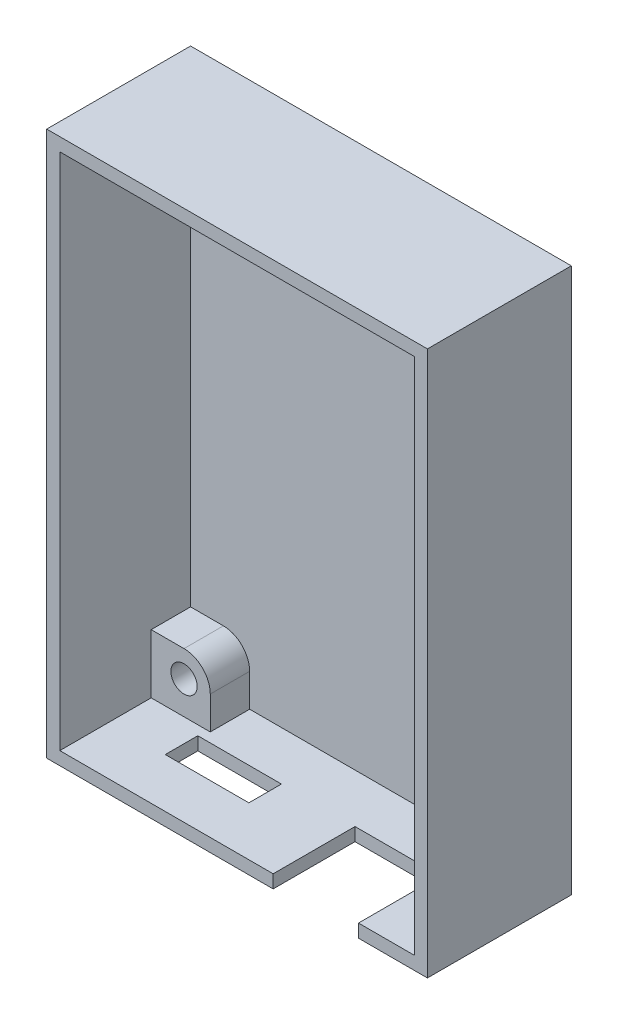
ISO-10303-21;
HEADER;
FILE_DESCRIPTION(('STEP AP214'),'2;1');
FILE_NAME('part.step','',(''),(''),'','','');
FILE_SCHEMA(('AUTOMOTIVE_DESIGN { 1 0 10303 214 1 1 1 1 }'));
ENDSEC;
DATA;
#1=APPLICATION_CONTEXT('core data for automotive mechanical design processes');
#2=APPLICATION_PROTOCOL_DEFINITION('international standard','automotive_design',2000,#1);
#3=PRODUCT_CONTEXT('',#1,'mechanical');
#4=PRODUCT('Part','Part','',(#3));
#5=PRODUCT_RELATED_PRODUCT_CATEGORY('part','',(#4));
#6=PRODUCT_DEFINITION_FORMATION('','',#4);
#7=PRODUCT_DEFINITION_CONTEXT('part definition',#1,'design');
#8=PRODUCT_DEFINITION('design','',#6,#7);
#9=PRODUCT_DEFINITION_SHAPE('','',#8);
#10=(LENGTH_UNIT() NAMED_UNIT(*) SI_UNIT(.MILLI.,.METRE.));
#11=(NAMED_UNIT(*) PLANE_ANGLE_UNIT() SI_UNIT($,.RADIAN.));
#12=(NAMED_UNIT(*) SI_UNIT($,.STERADIAN.) SOLID_ANGLE_UNIT());
#13=UNCERTAINTY_MEASURE_WITH_UNIT(LENGTH_MEASURE(1.E-05),#10,'distance_accuracy_value','');
#14=(GEOMETRIC_REPRESENTATION_CONTEXT(3) GLOBAL_UNCERTAINTY_ASSIGNED_CONTEXT((#13)) GLOBAL_UNIT_ASSIGNED_CONTEXT((#10,
#11,#12)) REPRESENTATION_CONTEXT('',''));
#15=CARTESIAN_POINT('',(0.,0.,0.));
#16=DIRECTION('',(0.,0.,1.));
#17=DIRECTION('',(1.,0.,0.));
#18=AXIS2_PLACEMENT_3D('',#15,#16,#17);
#19=CARTESIAN_POINT('',(0.,-41.5,21.92));
#20=DIRECTION('',(0.,1.,0.));
#21=DIRECTION('',(-1.,0.,0.));
#22=AXIS2_PLACEMENT_3D('',#19,#20,#21);
#23=PLANE('',#22);
#24=DIRECTION('',(0.,0.,1.));
#25=VECTOR('',#24,1.);
#26=CARTESIAN_POINT('',(-5.70999999999999,-41.5,9.45));
#27=LINE('',#26,#25);
#28=CARTESIAN_POINT('',(-5.70999999999999,-41.5,9.45));
#29=VERTEX_POINT('',#28);
#30=CARTESIAN_POINT('',(-5.71,-41.5,14.41));
#31=VERTEX_POINT('',#30);
#32=EDGE_CURVE('E272',#29,#31,#27,.T.);
#33=ORIENTED_EDGE('',*,*,#32,.F.);
#34=DIRECTION('',(1.,0.,0.));
#35=VECTOR('',#34,1.);
#36=CARTESIAN_POINT('',(-18.45,-41.5,9.45));
#37=LINE('',#36,#35);
#38=CARTESIAN_POINT('',(-18.45,-41.5,9.45));
#39=VERTEX_POINT('',#38);
#40=EDGE_CURVE('E266',#39,#29,#37,.T.);
#41=ORIENTED_EDGE('',*,*,#40,.F.);
#42=DIRECTION('',(0.,0.,-1.));
#43=VECTOR('',#42,1.);
#44=CARTESIAN_POINT('',(-18.45,-41.5,9.45));
#45=LINE('',#44,#43);
#46=CARTESIAN_POINT('',(-18.45,-41.5,14.41));
#47=VERTEX_POINT('',#46);
#48=EDGE_CURVE('E280',#47,#39,#45,.T.);
#49=ORIENTED_EDGE('',*,*,#48,.F.);
#50=DIRECTION('',(-1.,0.,0.));
#51=VECTOR('',#50,1.);
#52=CARTESIAN_POINT('',(-18.45,-41.5,14.41));
#53=LINE('',#52,#51);
#54=EDGE_CURVE('E57',#31,#47,#53,.T.);
#55=ORIENTED_EDGE('',*,*,#54,.F.);
#56=EDGE_LOOP('',(#33,#41,#49,#55));
#57=FACE_BOUND('',#56,.T.);
#58=DIRECTION('',(0.,0.,-1.));
#59=VECTOR('',#58,1.);
#60=CARTESIAN_POINT('',(5.50000000000001,-41.5,9.45));
#61=LINE('',#60,#59);
#62=CARTESIAN_POINT('',(5.5,-41.5,21.92));
#63=VERTEX_POINT('',#62);
#64=CARTESIAN_POINT('',(5.50000000000001,-41.5,9.45));
#65=VERTEX_POINT('',#64);
#66=EDGE_CURVE('E291',#63,#65,#61,.T.);
#67=ORIENTED_EDGE('',*,*,#66,.F.);
#68=DIRECTION('',(1.,0.,0.));
#69=VECTOR('',#68,1.);
#70=CARTESIAN_POINT('',(0.,-41.5,21.92));
#71=LINE('',#70,#69);
#72=CARTESIAN_POINT('',(-29.,-41.5,21.92));
#73=VERTEX_POINT('',#72);
#74=EDGE_CURVE('E502',#73,#63,#71,.T.);
#75=ORIENTED_EDGE('',*,*,#74,.F.);
#76=DIRECTION('',(0.,0.,-1.));
#77=VECTOR('',#76,1.);
#78=CARTESIAN_POINT('',(-29.,-41.5,21.92));
#79=LINE('',#78,#77);
#80=CARTESIAN_POINT('',(-29.,-41.5,0.));
#81=VERTEX_POINT('',#80);
#82=EDGE_CURVE('E525',#73,#81,#79,.T.);
#83=ORIENTED_EDGE('',*,*,#82,.T.);
#84=DIRECTION('',(1.,0.,0.));
#85=VECTOR('',#84,1.);
#86=CARTESIAN_POINT('',(0.,-41.5,0.));
#87=LINE('',#86,#85);
#88=CARTESIAN_POINT('',(29.,-41.5,0.));
#89=VERTEX_POINT('',#88);
#90=EDGE_CURVE('E514',#81,#89,#87,.T.);
#91=ORIENTED_EDGE('',*,*,#90,.T.);
#92=DIRECTION('',(0.,0.,-1.));
#93=VECTOR('',#92,1.);
#94=CARTESIAN_POINT('',(29.,-41.5,21.92));
#95=LINE('',#94,#93);
#96=CARTESIAN_POINT('',(29.,-41.5,21.92));
#97=VERTEX_POINT('',#96);
#98=EDGE_CURVE('E520',#97,#89,#95,.T.);
#99=ORIENTED_EDGE('',*,*,#98,.F.);
#100=CARTESIAN_POINT('',(18.5,-41.5,21.92));
#101=VERTEX_POINT('',#100);
#102=EDGE_CURVE('E504',#101,#97,#71,.T.);
#103=ORIENTED_EDGE('',*,*,#102,.F.);
#104=DIRECTION('',(0.,0.,1.));
#105=VECTOR('',#104,1.);
#106=CARTESIAN_POINT('',(18.5,-41.5,9.45000000000001));
#107=LINE('',#106,#105);
#108=CARTESIAN_POINT('',(18.5,-41.5,9.45000000000001));
#109=VERTEX_POINT('',#108);
#110=EDGE_CURVE('E290',#109,#101,#107,.T.);
#111=ORIENTED_EDGE('',*,*,#110,.F.);
#112=DIRECTION('',(1.,0.,0.));
#113=VECTOR('',#112,1.);
#114=CARTESIAN_POINT('',(5.50000000000001,-41.5,9.45));
#115=LINE('',#114,#113);
#116=EDGE_CURVE('E289',#65,#109,#115,.T.);
#117=ORIENTED_EDGE('',*,*,#116,.F.);
#118=EDGE_LOOP('',(#67,#75,#83,#91,#99,#103,#111,#117));
#119=FACE_BOUND('',#118,.T.);
#120=ADVANCED_FACE('F41',(#57,#119),#23,.F.);
#121=CARTESIAN_POINT('',(0.,-39.5,21.92));
#122=DIRECTION('',(0.,1.,0.));
#123=DIRECTION('',(-1.,0.,0.));
#124=AXIS2_PLACEMENT_3D('',#121,#122,#123);
#125=PLANE('',#124);
#126=DIRECTION('',(1.,0.,0.));
#127=VECTOR('',#126,1.);
#128=CARTESIAN_POINT('',(-18.45,-39.5,9.45));
#129=LINE('',#128,#127);
#130=CARTESIAN_POINT('',(-18.45,-39.5,9.45));
#131=VERTEX_POINT('',#130);
#132=CARTESIAN_POINT('',(-5.70999999999999,-39.5,9.45));
#133=VERTEX_POINT('',#132);
#134=EDGE_CURVE('E263',#131,#133,#129,.T.);
#135=ORIENTED_EDGE('',*,*,#134,.T.);
#136=DIRECTION('',(0.,0.,1.));
#137=VECTOR('',#136,1.);
#138=CARTESIAN_POINT('',(-5.70999999999999,-39.5,9.45));
#139=LINE('',#138,#137);
#140=CARTESIAN_POINT('',(-5.71,-39.5,14.41));
#141=VERTEX_POINT('',#140);
#142=EDGE_CURVE('E249',#133,#141,#139,.T.);
#143=ORIENTED_EDGE('',*,*,#142,.T.);
#144=DIRECTION('',(-1.,0.,0.));
#145=VECTOR('',#144,1.);
#146=CARTESIAN_POINT('',(-18.45,-39.5,14.41));
#147=LINE('',#146,#145);
#148=CARTESIAN_POINT('',(-18.45,-39.5,14.41));
#149=VERTEX_POINT('',#148);
#150=EDGE_CURVE('E283',#141,#149,#147,.T.);
#151=ORIENTED_EDGE('',*,*,#150,.T.);
#152=DIRECTION('',(0.,0.,-1.));
#153=VECTOR('',#152,1.);
#154=CARTESIAN_POINT('',(-18.45,-39.5,9.45));
#155=LINE('',#154,#153);
#156=EDGE_CURVE('E271',#149,#131,#155,.T.);
#157=ORIENTED_EDGE('',*,*,#156,.T.);
#158=EDGE_LOOP('',(#135,#143,#151,#157));
#159=FACE_BOUND('',#158,.T.);
#160=DIRECTION('',(1.,0.,0.));
#161=VECTOR('',#160,1.);
#162=CARTESIAN_POINT('',(0.,-39.5,21.92));
#163=LINE('',#162,#161);
#164=CARTESIAN_POINT('',(-27.,-39.5,21.92));
#165=VERTEX_POINT('',#164);
#166=CARTESIAN_POINT('',(5.5,-39.5,21.92));
#167=VERTEX_POINT('',#166);
#168=EDGE_CURVE('E491',#165,#167,#163,.T.);
#169=ORIENTED_EDGE('',*,*,#168,.T.);
#170=DIRECTION('',(0.,0.,-1.));
#171=VECTOR('',#170,1.);
#172=CARTESIAN_POINT('',(5.50000000000001,-39.5,9.45));
#173=LINE('',#172,#171);
#174=CARTESIAN_POINT('',(5.5,-39.5,9.45));
#175=VERTEX_POINT('',#174);
#176=EDGE_CURVE('E293',#167,#175,#173,.T.);
#177=ORIENTED_EDGE('',*,*,#176,.T.);
#178=DIRECTION('',(1.,0.,0.));
#179=VECTOR('',#178,1.);
#180=CARTESIAN_POINT('',(5.50000000000001,-39.5,9.45));
#181=LINE('',#180,#179);
#182=CARTESIAN_POINT('',(18.5,-39.5,9.45000000000001));
#183=VERTEX_POINT('',#182);
#184=EDGE_CURVE('E288',#175,#183,#181,.T.);
#185=ORIENTED_EDGE('',*,*,#184,.T.);
#186=DIRECTION('',(0.,0.,1.));
#187=VECTOR('',#186,1.);
#188=CARTESIAN_POINT('',(18.5,-39.5,9.45000000000001));
#189=LINE('',#188,#187);
#190=CARTESIAN_POINT('',(18.5,-39.5,21.92));
#191=VERTEX_POINT('',#190);
#192=EDGE_CURVE('E305',#183,#191,#189,.T.);
#193=ORIENTED_EDGE('',*,*,#192,.T.);
#194=CARTESIAN_POINT('',(27.,-39.5,21.92));
#195=VERTEX_POINT('',#194);
#196=EDGE_CURVE('E489',#191,#195,#163,.T.);
#197=ORIENTED_EDGE('',*,*,#196,.T.);
#198=DIRECTION('',(0.,0.,-1.));
#199=VECTOR('',#198,1.);
#200=CARTESIAN_POINT('',(27.,-39.5,21.92));
#201=LINE('',#200,#199);
#202=CARTESIAN_POINT('',(27.,-39.5,8.));
#203=VERTEX_POINT('',#202);
#204=EDGE_CURVE('E472',#195,#203,#201,.T.);
#205=ORIENTED_EDGE('',*,*,#204,.T.);
#206=DIRECTION('',(1.,0.,0.));
#207=VECTOR('',#206,1.);
#208=CARTESIAN_POINT('',(27.,-39.5,8.));
#209=LINE('',#208,#207);
#210=CARTESIAN_POINT('',(18.,-39.5,8.));
#211=VERTEX_POINT('',#210);
#212=EDGE_CURVE('E363',#211,#203,#209,.T.);
#213=ORIENTED_EDGE('',*,*,#212,.F.);
#214=DIRECTION('',(0.,0.,-1.));
#215=VECTOR('',#214,1.);
#216=CARTESIAN_POINT('',(18.,-39.5,8.));
#217=LINE('',#216,#215);
#218=CARTESIAN_POINT('',(18.,-39.5,2.));
#219=VERTEX_POINT('',#218);
#220=EDGE_CURVE('E385',#211,#219,#217,.T.);
#221=ORIENTED_EDGE('',*,*,#220,.T.);
#222=DIRECTION('',(1.,0.,0.));
#223=VECTOR('',#222,1.);
#224=CARTESIAN_POINT('',(0.,-39.5,2.));
#225=LINE('',#224,#223);
#226=CARTESIAN_POINT('',(-18.,-39.5,2.));
#227=VERTEX_POINT('',#226);
#228=EDGE_CURVE('E478',#227,#219,#225,.T.);
#229=ORIENTED_EDGE('',*,*,#228,.F.);
#230=DIRECTION('',(0.,0.,-1.));
#231=VECTOR('',#230,1.);
#232=CARTESIAN_POINT('',(-18.,-39.5,8.));
#233=LINE('',#232,#231);
#234=CARTESIAN_POINT('',(-18.,-39.5,8.));
#235=VERTEX_POINT('',#234);
#236=EDGE_CURVE('E414',#235,#227,#233,.T.);
#237=ORIENTED_EDGE('',*,*,#236,.F.);
#238=DIRECTION('',(1.,0.,0.));
#239=VECTOR('',#238,1.);
#240=CARTESIAN_POINT('',(-27.,-39.5,8.));
#241=LINE('',#240,#239);
#242=CARTESIAN_POINT('',(-27.,-39.5,8.));
#243=VERTEX_POINT('',#242);
#244=EDGE_CURVE('E399',#243,#235,#241,.T.);
#245=ORIENTED_EDGE('',*,*,#244,.F.);
#246=DIRECTION('',(0.,0.,-1.));
#247=VECTOR('',#246,1.);
#248=CARTESIAN_POINT('',(-27.,-39.5,21.92));
#249=LINE('',#248,#247);
#250=EDGE_CURVE('E467',#165,#243,#249,.T.);
#251=ORIENTED_EDGE('',*,*,#250,.F.);
#252=EDGE_LOOP('',(#169,#177,#185,#193,#197,#205,#213,#221,#229,#237,#245,#251));
#253=FACE_BOUND('',#252,.T.);
#254=ADVANCED_FACE('F267',(#159,#253),#125,.T.);
#255=CARTESIAN_POINT('',(0.,39.5,21.92));
#256=DIRECTION('',(0.,1.,0.));
#257=DIRECTION('',(-1.,0.,0.));
#258=AXIS2_PLACEMENT_3D('',#255,#256,#257);
#259=PLANE('',#258);
#260=DIRECTION('',(0.,0.,-1.));
#261=VECTOR('',#260,1.);
#262=CARTESIAN_POINT('',(18.,39.5,8.));
#263=LINE('',#262,#261);
#264=CARTESIAN_POINT('',(18.,39.5,8.));
#265=VERTEX_POINT('',#264);
#266=CARTESIAN_POINT('',(18.,39.5,2.));
#267=VERTEX_POINT('',#266);
#268=EDGE_CURVE('E340',#265,#267,#263,.T.);
#269=ORIENTED_EDGE('',*,*,#268,.F.);
#270=DIRECTION('',(-1.,0.,0.));
#271=VECTOR('',#270,1.);
#272=CARTESIAN_POINT('',(27.,39.5,8.));
#273=LINE('',#272,#271);
#274=CARTESIAN_POINT('',(27.,39.5,8.));
#275=VERTEX_POINT('',#274);
#276=EDGE_CURVE('E322',#275,#265,#273,.T.);
#277=ORIENTED_EDGE('',*,*,#276,.F.);
#278=DIRECTION('',(0.,0.,-1.));
#279=VECTOR('',#278,1.);
#280=CARTESIAN_POINT('',(27.,39.5,21.92));
#281=LINE('',#280,#279);
#282=CARTESIAN_POINT('',(27.,39.5,21.92));
#283=VERTEX_POINT('',#282);
#284=EDGE_CURVE('E468',#283,#275,#281,.T.);
#285=ORIENTED_EDGE('',*,*,#284,.F.);
#286=DIRECTION('',(1.,0.,0.));
#287=VECTOR('',#286,1.);
#288=CARTESIAN_POINT('',(0.,39.5,21.92));
#289=LINE('',#288,#287);
#290=CARTESIAN_POINT('',(-27.,39.5,21.92));
#291=VERTEX_POINT('',#290);
#292=EDGE_CURVE('E482',#291,#283,#289,.T.);
#293=ORIENTED_EDGE('',*,*,#292,.F.);
#294=DIRECTION('',(0.,0.,-1.));
#295=VECTOR('',#294,1.);
#296=CARTESIAN_POINT('',(-27.,39.5,21.92));
#297=LINE('',#296,#295);
#298=CARTESIAN_POINT('',(-27.,39.5,8.));
#299=VERTEX_POINT('',#298);
#300=EDGE_CURVE('E465',#291,#299,#297,.T.);
#301=ORIENTED_EDGE('',*,*,#300,.T.);
#302=DIRECTION('',(-1.,0.,0.));
#303=VECTOR('',#302,1.);
#304=CARTESIAN_POINT('',(-27.,39.5,8.));
#305=LINE('',#304,#303);
#306=CARTESIAN_POINT('',(-18.,39.5,8.));
#307=VERTEX_POINT('',#306);
#308=EDGE_CURVE('E433',#307,#299,#305,.T.);
#309=ORIENTED_EDGE('',*,*,#308,.F.);
#310=DIRECTION('',(0.,0.,-1.));
#311=VECTOR('',#310,1.);
#312=CARTESIAN_POINT('',(-18.,39.5,8.));
#313=LINE('',#312,#311);
#314=CARTESIAN_POINT('',(-18.,39.5,2.));
#315=VERTEX_POINT('',#314);
#316=EDGE_CURVE('E453',#307,#315,#313,.T.);
#317=ORIENTED_EDGE('',*,*,#316,.T.);
#318=DIRECTION('',(1.,0.,0.));
#319=VECTOR('',#318,1.);
#320=CARTESIAN_POINT('',(0.,39.5,2.));
#321=LINE('',#320,#319);
#322=EDGE_CURVE('E458',#315,#267,#321,.T.);
#323=ORIENTED_EDGE('',*,*,#322,.T.);
#324=EDGE_LOOP('',(#269,#277,#285,#293,#301,#309,#317,#323));
#325=FACE_BOUND('',#324,.T.);
#326=ADVANCED_FACE('F592',(#325),#259,.F.);
#327=CARTESIAN_POINT('',(-27.,0.,21.92));
#328=DIRECTION('',(-1.,0.,0.));
#329=DIRECTION('',(0.,0.,1.));
#330=AXIS2_PLACEMENT_3D('',#327,#328,#329);
#331=PLANE('',#330);
#332=DIRECTION('',(0.,-1.,0.));
#333=VECTOR('',#332,1.);
#334=CARTESIAN_POINT('',(-27.,-39.5,8.));
#335=LINE('',#334,#333);
#336=CARTESIAN_POINT('',(-27.,-30.5,8.));
#337=VERTEX_POINT('',#336);
#338=EDGE_CURVE('E400',#337,#243,#335,.T.);
#339=ORIENTED_EDGE('',*,*,#338,.F.);
#340=DIRECTION('',(0.,0.,-1.));
#341=VECTOR('',#340,1.);
#342=CARTESIAN_POINT('',(-27.,-30.5,8.));
#343=LINE('',#342,#341);
#344=CARTESIAN_POINT('',(-27.,-30.5,2.));
#345=VERTEX_POINT('',#344);
#346=EDGE_CURVE('E416',#337,#345,#343,.T.);
#347=ORIENTED_EDGE('',*,*,#346,.T.);
#348=DIRECTION('',(0.,1.,0.));
#349=VECTOR('',#348,1.);
#350=CARTESIAN_POINT('',(-27.,0.,2.));
#351=LINE('',#350,#349);
#352=CARTESIAN_POINT('',(-27.,30.5,2.));
#353=VERTEX_POINT('',#352);
#354=EDGE_CURVE('E462',#345,#353,#351,.T.);
#355=ORIENTED_EDGE('',*,*,#354,.T.);
#356=DIRECTION('',(0.,0.,-1.));
#357=VECTOR('',#356,1.);
#358=CARTESIAN_POINT('',(-27.,30.5,8.));
#359=LINE('',#358,#357);
#360=CARTESIAN_POINT('',(-27.,30.5,8.));
#361=VERTEX_POINT('',#360);
#362=EDGE_CURVE('E451',#361,#353,#359,.T.);
#363=ORIENTED_EDGE('',*,*,#362,.F.);
#364=DIRECTION('',(0.,-1.,0.));
#365=VECTOR('',#364,1.);
#366=CARTESIAN_POINT('',(-27.,39.5,8.));
#367=LINE('',#366,#365);
#368=EDGE_CURVE('E436',#299,#361,#367,.T.);
#369=ORIENTED_EDGE('',*,*,#368,.F.);
#370=ORIENTED_EDGE('',*,*,#300,.F.);
#371=DIRECTION('',(0.,1.,0.));
#372=VECTOR('',#371,1.);
#373=CARTESIAN_POINT('',(-27.,0.,21.92));
#374=LINE('',#373,#372);
#375=EDGE_CURVE('E490',#165,#291,#374,.T.);
#376=ORIENTED_EDGE('',*,*,#375,.F.);
#377=ORIENTED_EDGE('',*,*,#250,.T.);
#378=EDGE_LOOP('',(#339,#347,#355,#363,#369,#370,#376,#377));
#379=FACE_BOUND('',#378,.T.);
#380=ADVANCED_FACE('F608',(#379),#331,.F.);
#381=CARTESIAN_POINT('',(0.,0.,2.));
#382=DIRECTION('',(0.,0.,1.));
#383=DIRECTION('',(1.,0.,0.));
#384=AXIS2_PLACEMENT_3D('',#381,#382,#383);
#385=PLANE('',#384);
#386=DIRECTION('',(0.,1.,0.));
#387=VECTOR('',#386,1.);
#388=CARTESIAN_POINT('',(-18.,-39.5,2.));
#389=LINE('',#388,#387);
#390=CARTESIAN_POINT('',(-18.,-34.5,2.));
#391=VERTEX_POINT('',#390);
#392=EDGE_CURVE('E395',#227,#391,#389,.T.);
#393=ORIENTED_EDGE('',*,*,#392,.F.);
#394=ORIENTED_EDGE('',*,*,#228,.T.);
#395=DIRECTION('',(0.,-1.,0.));
#396=VECTOR('',#395,1.);
#397=CARTESIAN_POINT('',(18.,-39.5,2.));
#398=LINE('',#397,#396);
#399=CARTESIAN_POINT('',(18.,-34.5,2.));
#400=VERTEX_POINT('',#399);
#401=EDGE_CURVE('E375',#400,#219,#398,.T.);
#402=ORIENTED_EDGE('',*,*,#401,.F.);
#403=CARTESIAN_POINT('',(22.,-34.5,2.));
#404=DIRECTION('',(0.,0.,1.));
#405=DIRECTION('',(-1.,0.,0.));
#406=AXIS2_PLACEMENT_3D('',#403,#404,#405);
#407=CIRCLE('',#406,4.);
#408=CARTESIAN_POINT('',(22.,-30.5,2.));
#409=VERTEX_POINT('',#408);
#410=EDGE_CURVE('E354',#409,#400,#407,.T.);
#411=ORIENTED_EDGE('',*,*,#410,.F.);
#412=DIRECTION('',(-1.,0.,0.));
#413=VECTOR('',#412,1.);
#414=CARTESIAN_POINT('',(27.,-30.5,2.));
#415=LINE('',#414,#413);
#416=CARTESIAN_POINT('',(27.,-30.5,2.));
#417=VERTEX_POINT('',#416);
#418=EDGE_CURVE('E357',#417,#409,#415,.T.);
#419=ORIENTED_EDGE('',*,*,#418,.F.);
#420=DIRECTION('',(0.,1.,0.));
#421=VECTOR('',#420,1.);
#422=CARTESIAN_POINT('',(27.,0.,2.));
#423=LINE('',#422,#421);
#424=CARTESIAN_POINT('',(27.,30.5,2.));
#425=VERTEX_POINT('',#424);
#426=EDGE_CURVE('E477',#417,#425,#423,.T.);
#427=ORIENTED_EDGE('',*,*,#426,.T.);
#428=DIRECTION('',(1.,0.,0.));
#429=VECTOR('',#428,1.);
#430=CARTESIAN_POINT('',(27.,30.5,2.));
#431=LINE('',#430,#429);
#432=CARTESIAN_POINT('',(22.,30.5,2.));
#433=VERTEX_POINT('',#432);
#434=EDGE_CURVE('E335',#433,#425,#431,.T.);
#435=ORIENTED_EDGE('',*,*,#434,.F.);
#436=CARTESIAN_POINT('',(22.,34.5,2.));
#437=DIRECTION('',(0.,0.,1.));
#438=DIRECTION('',(1.,0.,0.));
#439=AXIS2_PLACEMENT_3D('',#436,#437,#438);
#440=CIRCLE('',#439,4.);
#441=CARTESIAN_POINT('',(18.,34.5,2.));
#442=VERTEX_POINT('',#441);
#443=EDGE_CURVE('E315',#442,#433,#440,.T.);
#444=ORIENTED_EDGE('',*,*,#443,.F.);
#445=DIRECTION('',(0.,-1.,0.));
#446=VECTOR('',#445,1.);
#447=CARTESIAN_POINT('',(18.,39.5,2.));
#448=LINE('',#447,#446);
#449=EDGE_CURVE('E318',#267,#442,#448,.T.);
#450=ORIENTED_EDGE('',*,*,#449,.F.);
#451=ORIENTED_EDGE('',*,*,#322,.F.);
#452=DIRECTION('',(0.,1.,0.));
#453=VECTOR('',#452,1.);
#454=CARTESIAN_POINT('',(-18.,39.5,2.));
#455=LINE('',#454,#453);
#456=CARTESIAN_POINT('',(-18.,34.5,2.));
#457=VERTEX_POINT('',#456);
#458=EDGE_CURVE('E441',#457,#315,#455,.T.);
#459=ORIENTED_EDGE('',*,*,#458,.F.);
#460=CARTESIAN_POINT('',(-22.,34.5,2.));
#461=DIRECTION('',(0.,0.,1.));
#462=DIRECTION('',(-1.,0.,0.));
#463=AXIS2_PLACEMENT_3D('',#460,#461,#462);
#464=CIRCLE('',#463,4.);
#465=CARTESIAN_POINT('',(-22.,30.5,2.));
#466=VERTEX_POINT('',#465);
#467=EDGE_CURVE('E422',#466,#457,#464,.T.);
#468=ORIENTED_EDGE('',*,*,#467,.F.);
#469=DIRECTION('',(1.,0.,0.));
#470=VECTOR('',#469,1.);
#471=CARTESIAN_POINT('',(-27.,30.5,2.));
#472=LINE('',#471,#470);
#473=EDGE_CURVE('E429',#353,#466,#472,.T.);
#474=ORIENTED_EDGE('',*,*,#473,.F.);
#475=ORIENTED_EDGE('',*,*,#354,.F.);
#476=DIRECTION('',(-1.,0.,0.));
#477=VECTOR('',#476,1.);
#478=CARTESIAN_POINT('',(-27.,-30.5,2.));
#479=LINE('',#478,#477);
#480=CARTESIAN_POINT('',(-22.,-30.5,2.));
#481=VERTEX_POINT('',#480);
#482=EDGE_CURVE('E407',#481,#345,#479,.T.);
#483=ORIENTED_EDGE('',*,*,#482,.F.);
#484=CARTESIAN_POINT('',(-22.,-34.5,2.));
#485=DIRECTION('',(0.,0.,1.));
#486=DIRECTION('',(1.,0.,0.));
#487=AXIS2_PLACEMENT_3D('',#484,#485,#486);
#488=CIRCLE('',#487,4.);
#489=EDGE_CURVE('E386',#391,#481,#488,.T.);
#490=ORIENTED_EDGE('',*,*,#489,.F.);
#491=EDGE_LOOP('',(#393,#394,#402,#411,#419,#427,#435,#444,#450,#451,#459,#468,#474,#475,#483,#490));
#492=FACE_BOUND('',#491,.T.);
#493=ADVANCED_FACE('F588',(#492),#385,.T.);
#494=CARTESIAN_POINT('',(0.,0.,21.92));
#495=DIRECTION('',(0.,0.,1.));
#496=DIRECTION('',(1.,0.,0.));
#497=AXIS2_PLACEMENT_3D('',#494,#495,#496);
#498=PLANE('',#497);
#499=DIRECTION('',(0.,1.,0.));
#500=VECTOR('',#499,1.);
#501=CARTESIAN_POINT('',(18.5,0.,21.92));
#502=LINE('',#501,#500);
#503=EDGE_CURVE('E11',#101,#191,#502,.T.);
#504=ORIENTED_EDGE('',*,*,#503,.F.);
#505=ORIENTED_EDGE('',*,*,#102,.T.);
#506=DIRECTION('',(0.,1.,0.));
#507=VECTOR('',#506,1.);
#508=CARTESIAN_POINT('',(29.,0.,21.92));
#509=LINE('',#508,#507);
#510=CARTESIAN_POINT('',(29.,41.5,21.92));
#511=VERTEX_POINT('',#510);
#512=EDGE_CURVE('E506',#97,#511,#509,.T.);
#513=ORIENTED_EDGE('',*,*,#512,.T.);
#514=DIRECTION('',(1.,0.,0.));
#515=VECTOR('',#514,1.);
#516=CARTESIAN_POINT('',(0.,41.5,21.92));
#517=LINE('',#516,#515);
#518=CARTESIAN_POINT('',(-29.,41.5,21.92));
#519=VERTEX_POINT('',#518);
#520=EDGE_CURVE('E494',#519,#511,#517,.T.);
#521=ORIENTED_EDGE('',*,*,#520,.F.);
#522=DIRECTION('',(0.,1.,0.));
#523=VECTOR('',#522,1.);
#524=CARTESIAN_POINT('',(-29.,0.,21.92));
#525=LINE('',#524,#523);
#526=EDGE_CURVE('E499',#73,#519,#525,.T.);
#527=ORIENTED_EDGE('',*,*,#526,.F.);
#528=ORIENTED_EDGE('',*,*,#74,.T.);
#529=DIRECTION('',(0.,-1.,0.));
#530=VECTOR('',#529,1.);
#531=CARTESIAN_POINT('',(5.5,0.,21.92));
#532=LINE('',#531,#530);
#533=EDGE_CURVE('E47',#167,#63,#532,.T.);
#534=ORIENTED_EDGE('',*,*,#533,.F.);
#535=ORIENTED_EDGE('',*,*,#168,.F.);
#536=ORIENTED_EDGE('',*,*,#375,.T.);
#537=ORIENTED_EDGE('',*,*,#292,.T.);
#538=DIRECTION('',(0.,1.,0.));
#539=VECTOR('',#538,1.);
#540=CARTESIAN_POINT('',(27.,0.,21.92));
#541=LINE('',#540,#539);
#542=EDGE_CURVE('E471',#195,#283,#541,.T.);
#543=ORIENTED_EDGE('',*,*,#542,.F.);
#544=ORIENTED_EDGE('',*,*,#196,.F.);
#545=EDGE_LOOP('',(#504,#505,#513,#521,#527,#528,#534,#535,#536,#537,#543,#544));
#546=FACE_BOUND('',#545,.T.);
#547=ADVANCED_FACE('F548',(#546),#498,.T.);
#548=CARTESIAN_POINT('',(0.,41.5,21.92));
#549=DIRECTION('',(0.,1.,0.));
#550=DIRECTION('',(-1.,0.,0.));
#551=AXIS2_PLACEMENT_3D('',#548,#549,#550);
#552=PLANE('',#551);
#553=DIRECTION('',(1.,0.,0.));
#554=VECTOR('',#553,1.);
#555=CARTESIAN_POINT('',(0.,41.5,0.));
#556=LINE('',#555,#554);
#557=CARTESIAN_POINT('',(-29.,41.5,0.));
#558=VERTEX_POINT('',#557);
#559=CARTESIAN_POINT('',(29.,41.5,0.));
#560=VERTEX_POINT('',#559);
#561=EDGE_CURVE('E470',#558,#560,#556,.T.);
#562=ORIENTED_EDGE('',*,*,#561,.F.);
#563=DIRECTION('',(0.,0.,-1.));
#564=VECTOR('',#563,1.);
#565=CARTESIAN_POINT('',(-29.,41.5,21.92));
#566=LINE('',#565,#564);
#567=EDGE_CURVE('E523',#519,#558,#566,.T.);
#568=ORIENTED_EDGE('',*,*,#567,.F.);
#569=ORIENTED_EDGE('',*,*,#520,.T.);
#570=DIRECTION('',(0.,0.,-1.));
#571=VECTOR('',#570,1.);
#572=CARTESIAN_POINT('',(29.,41.5,21.92));
#573=LINE('',#572,#571);
#574=EDGE_CURVE('E507',#511,#560,#573,.T.);
#575=ORIENTED_EDGE('',*,*,#574,.T.);
#576=EDGE_LOOP('',(#562,#568,#569,#575));
#577=FACE_BOUND('',#576,.T.);
#578=ADVANCED_FACE('F43',(#577),#552,.T.);
#579=CARTESIAN_POINT('',(-29.,0.,21.92));
#580=DIRECTION('',(-1.,0.,0.));
#581=DIRECTION('',(0.,0.,1.));
#582=AXIS2_PLACEMENT_3D('',#579,#580,#581);
#583=PLANE('',#582);
#584=DIRECTION('',(0.,1.,0.));
#585=VECTOR('',#584,1.);
#586=CARTESIAN_POINT('',(-29.,0.,0.));
#587=LINE('',#586,#585);
#588=EDGE_CURVE('E512',#81,#558,#587,.T.);
#589=ORIENTED_EDGE('',*,*,#588,.F.);
#590=ORIENTED_EDGE('',*,*,#82,.F.);
#591=ORIENTED_EDGE('',*,*,#526,.T.);
#592=ORIENTED_EDGE('',*,*,#567,.T.);
#593=EDGE_LOOP('',(#589,#590,#591,#592));
#594=FACE_BOUND('',#593,.T.);
#595=ADVANCED_FACE('F554',(#594),#583,.T.);
#596=CARTESIAN_POINT('',(29.,0.,21.92));
#597=DIRECTION('',(-1.,0.,0.));
#598=DIRECTION('',(0.,0.,1.));
#599=AXIS2_PLACEMENT_3D('',#596,#597,#598);
#600=PLANE('',#599);
#601=DIRECTION('',(0.,1.,0.));
#602=VECTOR('',#601,1.);
#603=CARTESIAN_POINT('',(29.,0.,0.));
#604=LINE('',#603,#602);
#605=EDGE_CURVE('E496',#89,#560,#604,.T.);
#606=ORIENTED_EDGE('',*,*,#605,.T.);
#607=ORIENTED_EDGE('',*,*,#574,.F.);
#608=ORIENTED_EDGE('',*,*,#512,.F.);
#609=ORIENTED_EDGE('',*,*,#98,.T.);
#610=EDGE_LOOP('',(#606,#607,#608,#609));
#611=FACE_BOUND('',#610,.T.);
#612=ADVANCED_FACE('F565',(#611),#600,.F.);
#613=CARTESIAN_POINT('',(0.,0.,0.));
#614=DIRECTION('',(0.,0.,1.));
#615=DIRECTION('',(1.,0.,0.));
#616=AXIS2_PLACEMENT_3D('',#613,#614,#615);
#617=PLANE('',#616);
#618=ORIENTED_EDGE('',*,*,#561,.T.);
#619=ORIENTED_EDGE('',*,*,#605,.F.);
#620=ORIENTED_EDGE('',*,*,#90,.F.);
#621=ORIENTED_EDGE('',*,*,#588,.T.);
#622=EDGE_LOOP('',(#618,#619,#620,#621));
#623=FACE_BOUND('',#622,.T.);
#624=ADVANCED_FACE('F560',(#623),#617,.F.);
#625=CARTESIAN_POINT('',(27.,0.,21.92));
#626=DIRECTION('',(-1.,0.,0.));
#627=DIRECTION('',(0.,0.,1.));
#628=AXIS2_PLACEMENT_3D('',#625,#626,#627);
#629=PLANE('',#628);
#630=DIRECTION('',(0.,0.,-1.));
#631=VECTOR('',#630,1.);
#632=CARTESIAN_POINT('',(27.,-30.5,8.));
#633=LINE('',#632,#631);
#634=CARTESIAN_POINT('',(27.,-30.5,8.));
#635=VERTEX_POINT('',#634);
#636=EDGE_CURVE('E377',#635,#417,#633,.T.);
#637=ORIENTED_EDGE('',*,*,#636,.F.);
#638=DIRECTION('',(0.,1.,0.));
#639=VECTOR('',#638,1.);
#640=CARTESIAN_POINT('',(27.,-39.5,8.));
#641=LINE('',#640,#639);
#642=EDGE_CURVE('E365',#203,#635,#641,.T.);
#643=ORIENTED_EDGE('',*,*,#642,.F.);
#644=ORIENTED_EDGE('',*,*,#204,.F.);
#645=ORIENTED_EDGE('',*,*,#542,.T.);
#646=ORIENTED_EDGE('',*,*,#284,.T.);
#647=DIRECTION('',(0.,1.,0.));
#648=VECTOR('',#647,1.);
#649=CARTESIAN_POINT('',(27.,39.5,8.));
#650=LINE('',#649,#648);
#651=CARTESIAN_POINT('',(27.,30.5,8.));
#652=VERTEX_POINT('',#651);
#653=EDGE_CURVE('E321',#652,#275,#650,.T.);
#654=ORIENTED_EDGE('',*,*,#653,.F.);
#655=DIRECTION('',(0.,0.,-1.));
#656=VECTOR('',#655,1.);
#657=CARTESIAN_POINT('',(27.,30.5,8.));
#658=LINE('',#657,#656);
#659=EDGE_CURVE('E345',#652,#425,#658,.T.);
#660=ORIENTED_EDGE('',*,*,#659,.T.);
#661=ORIENTED_EDGE('',*,*,#426,.F.);
#662=EDGE_LOOP('',(#637,#643,#644,#645,#646,#654,#660,#661));
#663=FACE_BOUND('',#662,.T.);
#664=ADVANCED_FACE('F611',(#663),#629,.T.);
#665=CARTESIAN_POINT('',(-22.,34.5,8.));
#666=DIRECTION('',(0.,0.,-1.));
#667=DIRECTION('',(-1.,0.,0.));
#668=AXIS2_PLACEMENT_3D('',#665,#666,#667);
#669=PLANE('',#668);
#670=CARTESIAN_POINT('',(-22.,34.5,8.));
#671=DIRECTION('',(0.,0.,1.));
#672=DIRECTION('',(-1.,0.,0.));
#673=AXIS2_PLACEMENT_3D('',#670,#671,#672);
#674=CIRCLE('',#673,4.);
#675=CARTESIAN_POINT('',(-22.,30.5,8.));
#676=VERTEX_POINT('',#675);
#677=CARTESIAN_POINT('',(-18.,34.5,8.));
#678=VERTEX_POINT('',#677);
#679=EDGE_CURVE('E426',#676,#678,#674,.T.);
#680=ORIENTED_EDGE('',*,*,#679,.T.);
#681=DIRECTION('',(0.,1.,0.));
#682=VECTOR('',#681,1.);
#683=CARTESIAN_POINT('',(-18.,39.5,8.));
#684=LINE('',#683,#682);
#685=EDGE_CURVE('E427',#678,#307,#684,.T.);
#686=ORIENTED_EDGE('',*,*,#685,.T.);
#687=ORIENTED_EDGE('',*,*,#308,.T.);
#688=ORIENTED_EDGE('',*,*,#368,.T.);
#689=DIRECTION('',(1.,0.,0.));
#690=VECTOR('',#689,1.);
#691=CARTESIAN_POINT('',(-27.,30.5,8.));
#692=LINE('',#691,#690);
#693=EDGE_CURVE('E438',#361,#676,#692,.T.);
#694=ORIENTED_EDGE('',*,*,#693,.T.);
#695=EDGE_LOOP('',(#680,#686,#687,#688,#694));
#696=FACE_BOUND('',#695,.T.);
#697=CARTESIAN_POINT('',(-22.,34.5,8.));
#698=DIRECTION('',(0.,0.,1.));
#699=DIRECTION('',(1.,0.,0.));
#700=AXIS2_PLACEMENT_3D('',#697,#698,#699);
#701=CIRCLE('',#700,2.);
#702=CARTESIAN_POINT('',(-20.,34.5,8.));
#703=VERTEX_POINT('',#702);
#704=EDGE_CURVE('E346',#703,#703,#701,.T.);
#705=ORIENTED_EDGE('',*,*,#704,.F.);
#706=EDGE_LOOP('',(#705));
#707=FACE_BOUND('',#706,.T.);
#708=ADVANCED_FACE('F619',(#696,#707),#669,.F.);
#709=CARTESIAN_POINT('',(-22.,34.5,8.));
#710=DIRECTION('',(0.,0.,-1.));
#711=DIRECTION('',(-1.,0.,0.));
#712=AXIS2_PLACEMENT_3D('',#709,#710,#711);
#713=CYLINDRICAL_SURFACE('',#712,4.);
#714=ORIENTED_EDGE('',*,*,#467,.T.);
#715=DIRECTION('',(0.,0.,-1.));
#716=VECTOR('',#715,1.);
#717=CARTESIAN_POINT('',(-18.,34.5,8.));
#718=LINE('',#717,#716);
#719=EDGE_CURVE('E460',#678,#457,#718,.T.);
#720=ORIENTED_EDGE('',*,*,#719,.F.);
#721=ORIENTED_EDGE('',*,*,#679,.F.);
#722=DIRECTION('',(0.,0.,-1.));
#723=VECTOR('',#722,1.);
#724=CARTESIAN_POINT('',(-22.,30.5,8.));
#725=LINE('',#724,#723);
#726=EDGE_CURVE('E442',#676,#466,#725,.T.);
#727=ORIENTED_EDGE('',*,*,#726,.T.);
#728=EDGE_LOOP('',(#714,#720,#721,#727));
#729=FACE_BOUND('',#728,.T.);
#730=ADVANCED_FACE('F623',(#729),#713,.T.);
#731=CARTESIAN_POINT('',(-18.,39.5,8.));
#732=DIRECTION('',(-1.,0.,0.));
#733=DIRECTION('',(0.,0.,1.));
#734=AXIS2_PLACEMENT_3D('',#731,#732,#733);
#735=PLANE('',#734);
#736=ORIENTED_EDGE('',*,*,#458,.T.);
#737=ORIENTED_EDGE('',*,*,#316,.F.);
#738=ORIENTED_EDGE('',*,*,#685,.F.);
#739=ORIENTED_EDGE('',*,*,#719,.T.);
#740=EDGE_LOOP('',(#736,#737,#738,#739));
#741=FACE_BOUND('',#740,.T.);
#742=ADVANCED_FACE('F638',(#741),#735,.F.);
#743=CARTESIAN_POINT('',(-27.,30.5,8.));
#744=DIRECTION('',(0.,1.,0.));
#745=DIRECTION('',(-1.,0.,0.));
#746=AXIS2_PLACEMENT_3D('',#743,#744,#745);
#747=PLANE('',#746);
#748=ORIENTED_EDGE('',*,*,#473,.T.);
#749=ORIENTED_EDGE('',*,*,#726,.F.);
#750=ORIENTED_EDGE('',*,*,#693,.F.);
#751=ORIENTED_EDGE('',*,*,#362,.T.);
#752=EDGE_LOOP('',(#748,#749,#750,#751));
#753=FACE_BOUND('',#752,.T.);
#754=ADVANCED_FACE('F639',(#753),#747,.F.);
#755=CARTESIAN_POINT('',(-22.,34.5,8.));
#756=DIRECTION('',(0.,0.,-1.));
#757=DIRECTION('',(-1.,0.,0.));
#758=AXIS2_PLACEMENT_3D('',#755,#756,#757);
#759=CYLINDRICAL_SURFACE('',#758,2.);
#760=ORIENTED_EDGE('',*,*,#704,.T.);
#761=EDGE_LOOP('',(#760));
#762=FACE_BOUND('',#761,.T.);
#763=CARTESIAN_POINT('',(-22.,34.5,2.));
#764=DIRECTION('',(0.,0.,1.));
#765=DIRECTION('',(1.,0.,0.));
#766=AXIS2_PLACEMENT_3D('',#763,#764,#765);
#767=CIRCLE('',#766,2.);
#768=CARTESIAN_POINT('',(-20.,34.5,2.));
#769=VERTEX_POINT('',#768);
#770=EDGE_CURVE('E528',#769,#769,#767,.F.);
#771=ORIENTED_EDGE('',*,*,#770,.T.);
#772=EDGE_LOOP('',(#771));
#773=FACE_BOUND('',#772,.T.);
#774=ADVANCED_FACE('F641',(#762,#773),#759,.F.);
#775=ORIENTED_EDGE('',*,*,#770,.F.);
#776=EDGE_LOOP('',(#775));
#777=FACE_BOUND('',#776,.T.);
#778=ADVANCED_FACE('F614',(#777),#385,.T.);
#779=CARTESIAN_POINT('',(22.,34.5,8.));
#780=DIRECTION('',(0.,0.,1.));
#781=DIRECTION('',(1.,0.,0.));
#782=AXIS2_PLACEMENT_3D('',#779,#780,#781);
#783=PLANE('',#782);
#784=CARTESIAN_POINT('',(22.,34.5,8.));
#785=DIRECTION('',(0.,0.,1.));
#786=DIRECTION('',(1.,0.,0.));
#787=AXIS2_PLACEMENT_3D('',#784,#785,#786);
#788=CIRCLE('',#787,4.);
#789=CARTESIAN_POINT('',(18.,34.5,8.));
#790=VERTEX_POINT('',#789);
#791=CARTESIAN_POINT('',(22.,30.5,8.));
#792=VERTEX_POINT('',#791);
#793=EDGE_CURVE('E314',#790,#792,#788,.T.);
#794=ORIENTED_EDGE('',*,*,#793,.T.);
#795=DIRECTION('',(1.,0.,0.));
#796=VECTOR('',#795,1.);
#797=CARTESIAN_POINT('',(27.,30.5,8.));
#798=LINE('',#797,#796);
#799=EDGE_CURVE('E320',#792,#652,#798,.T.);
#800=ORIENTED_EDGE('',*,*,#799,.T.);
#801=ORIENTED_EDGE('',*,*,#653,.T.);
#802=ORIENTED_EDGE('',*,*,#276,.T.);
#803=DIRECTION('',(0.,-1.,0.));
#804=VECTOR('',#803,1.);
#805=CARTESIAN_POINT('',(18.,39.5,8.));
#806=LINE('',#805,#804);
#807=EDGE_CURVE('E330',#265,#790,#806,.T.);
#808=ORIENTED_EDGE('',*,*,#807,.T.);
#809=EDGE_LOOP('',(#794,#800,#801,#802,#808));
#810=FACE_BOUND('',#809,.T.);
#811=CARTESIAN_POINT('',(22.,34.5,8.));
#812=DIRECTION('',(0.,0.,1.));
#813=DIRECTION('',(-1.,0.,0.));
#814=AXIS2_PLACEMENT_3D('',#811,#812,#813);
#815=CIRCLE('',#814,2.);
#816=CARTESIAN_POINT('',(20.,34.5,8.));
#817=VERTEX_POINT('',#816);
#818=EDGE_CURVE('E310',#817,#817,#815,.T.);
#819=ORIENTED_EDGE('',*,*,#818,.F.);
#820=EDGE_LOOP('',(#819));
#821=FACE_BOUND('',#820,.T.);
#822=ADVANCED_FACE('F691',(#810,#821),#783,.T.);
#823=CARTESIAN_POINT('',(22.,34.5,8.));
#824=DIRECTION('',(0.,0.,-1.));
#825=DIRECTION('',(-1.,0.,0.));
#826=AXIS2_PLACEMENT_3D('',#823,#824,#825);
#827=CYLINDRICAL_SURFACE('',#826,4.);
#828=ORIENTED_EDGE('',*,*,#443,.T.);
#829=DIRECTION('',(0.,0.,-1.));
#830=VECTOR('',#829,1.);
#831=CARTESIAN_POINT('',(22.,30.5,8.));
#832=LINE('',#831,#830);
#833=EDGE_CURVE('E344',#792,#433,#832,.T.);
#834=ORIENTED_EDGE('',*,*,#833,.F.);
#835=ORIENTED_EDGE('',*,*,#793,.F.);
#836=DIRECTION('',(0.,0.,-1.));
#837=VECTOR('',#836,1.);
#838=CARTESIAN_POINT('',(18.,34.5,8.));
#839=LINE('',#838,#837);
#840=EDGE_CURVE('E328',#790,#442,#839,.T.);
#841=ORIENTED_EDGE('',*,*,#840,.T.);
#842=EDGE_LOOP('',(#828,#834,#835,#841));
#843=FACE_BOUND('',#842,.T.);
#844=ADVANCED_FACE('F688',(#843),#827,.T.);
#845=CARTESIAN_POINT('',(27.,30.5,8.));
#846=DIRECTION('',(0.,1.,0.));
#847=DIRECTION('',(-1.,0.,0.));
#848=AXIS2_PLACEMENT_3D('',#845,#846,#847);
#849=PLANE('',#848);
#850=ORIENTED_EDGE('',*,*,#434,.T.);
#851=ORIENTED_EDGE('',*,*,#659,.F.);
#852=ORIENTED_EDGE('',*,*,#799,.F.);
#853=ORIENTED_EDGE('',*,*,#833,.T.);
#854=EDGE_LOOP('',(#850,#851,#852,#853));
#855=FACE_BOUND('',#854,.T.);
#856=ADVANCED_FACE('F692',(#855),#849,.F.);
#857=CARTESIAN_POINT('',(18.,39.5,8.));
#858=DIRECTION('',(1.,0.,0.));
#859=DIRECTION('',(0.,0.,-1.));
#860=AXIS2_PLACEMENT_3D('',#857,#858,#859);
#861=PLANE('',#860);
#862=ORIENTED_EDGE('',*,*,#449,.T.);
#863=ORIENTED_EDGE('',*,*,#840,.F.);
#864=ORIENTED_EDGE('',*,*,#807,.F.);
#865=ORIENTED_EDGE('',*,*,#268,.T.);
#866=EDGE_LOOP('',(#862,#863,#864,#865));
#867=FACE_BOUND('',#866,.T.);
#868=ADVANCED_FACE('F700',(#867),#861,.F.);
#869=CARTESIAN_POINT('',(22.,34.5,8.));
#870=DIRECTION('',(0.,0.,-1.));
#871=DIRECTION('',(-1.,0.,0.));
#872=AXIS2_PLACEMENT_3D('',#869,#870,#871);
#873=CYLINDRICAL_SURFACE('',#872,2.);
#874=ORIENTED_EDGE('',*,*,#818,.T.);
#875=EDGE_LOOP('',(#874));
#876=FACE_BOUND('',#875,.T.);
#877=CARTESIAN_POINT('',(22.,34.5,2.));
#878=DIRECTION('',(0.,0.,1.));
#879=DIRECTION('',(1.,0.,0.));
#880=AXIS2_PLACEMENT_3D('',#877,#878,#879);
#881=CIRCLE('',#880,2.);
#882=CARTESIAN_POINT('',(24.,34.5,2.));
#883=VERTEX_POINT('',#882);
#884=EDGE_CURVE('E530',#883,#883,#881,.F.);
#885=ORIENTED_EDGE('',*,*,#884,.T.);
#886=EDGE_LOOP('',(#885));
#887=FACE_BOUND('',#886,.T.);
#888=ADVANCED_FACE('F701',(#876,#887),#873,.F.);
#889=ORIENTED_EDGE('',*,*,#884,.F.);
#890=EDGE_LOOP('',(#889));
#891=FACE_BOUND('',#890,.T.);
#892=ADVANCED_FACE('F685',(#891),#385,.T.);
#893=CARTESIAN_POINT('',(22.,-34.5,8.));
#894=DIRECTION('',(0.,0.,-1.));
#895=DIRECTION('',(-1.,0.,0.));
#896=AXIS2_PLACEMENT_3D('',#893,#894,#895);
#897=PLANE('',#896);
#898=CARTESIAN_POINT('',(22.,-34.5,8.));
#899=DIRECTION('',(0.,0.,1.));
#900=DIRECTION('',(-1.,0.,0.));
#901=AXIS2_PLACEMENT_3D('',#898,#899,#900);
#902=CIRCLE('',#901,4.);
#903=CARTESIAN_POINT('',(22.,-30.5,8.));
#904=VERTEX_POINT('',#903);
#905=CARTESIAN_POINT('',(18.,-34.5,8.));
#906=VERTEX_POINT('',#905);
#907=EDGE_CURVE('E355',#904,#906,#902,.T.);
#908=ORIENTED_EDGE('',*,*,#907,.T.);
#909=DIRECTION('',(0.,-1.,0.));
#910=VECTOR('',#909,1.);
#911=CARTESIAN_POINT('',(18.,-39.5,8.));
#912=LINE('',#911,#910);
#913=EDGE_CURVE('E360',#906,#211,#912,.T.);
#914=ORIENTED_EDGE('',*,*,#913,.T.);
#915=ORIENTED_EDGE('',*,*,#212,.T.);
#916=ORIENTED_EDGE('',*,*,#642,.T.);
#917=DIRECTION('',(-1.,0.,0.));
#918=VECTOR('',#917,1.);
#919=CARTESIAN_POINT('',(27.,-30.5,8.));
#920=LINE('',#919,#918);
#921=EDGE_CURVE('E370',#635,#904,#920,.T.);
#922=ORIENTED_EDGE('',*,*,#921,.T.);
#923=EDGE_LOOP('',(#908,#914,#915,#916,#922));
#924=FACE_BOUND('',#923,.T.);
#925=CARTESIAN_POINT('',(22.,-34.5,8.));
#926=DIRECTION('',(0.,0.,1.));
#927=DIRECTION('',(1.,0.,0.));
#928=AXIS2_PLACEMENT_3D('',#925,#926,#927);
#929=CIRCLE('',#928,2.);
#930=CARTESIAN_POINT('',(24.,-34.5,8.));
#931=VERTEX_POINT('',#930);
#932=EDGE_CURVE('E349',#931,#931,#929,.T.);
#933=ORIENTED_EDGE('',*,*,#932,.F.);
#934=EDGE_LOOP('',(#933));
#935=FACE_BOUND('',#934,.T.);
#936=ADVANCED_FACE('F675',(#924,#935),#897,.F.);
#937=CARTESIAN_POINT('',(22.,-34.5,8.));
#938=DIRECTION('',(0.,0.,-1.));
#939=DIRECTION('',(-1.,0.,0.));
#940=AXIS2_PLACEMENT_3D('',#937,#938,#939);
#941=CYLINDRICAL_SURFACE('',#940,4.);
#942=ORIENTED_EDGE('',*,*,#410,.T.);
#943=DIRECTION('',(0.,0.,-1.));
#944=VECTOR('',#943,1.);
#945=CARTESIAN_POINT('',(18.,-34.5,8.));
#946=LINE('',#945,#944);
#947=EDGE_CURVE('E311',#906,#400,#946,.T.);
#948=ORIENTED_EDGE('',*,*,#947,.F.);
#949=ORIENTED_EDGE('',*,*,#907,.F.);
#950=DIRECTION('',(0.,0.,-1.));
#951=VECTOR('',#950,1.);
#952=CARTESIAN_POINT('',(22.,-30.5,8.));
#953=LINE('',#952,#951);
#954=EDGE_CURVE('E369',#904,#409,#953,.T.);
#955=ORIENTED_EDGE('',*,*,#954,.T.);
#956=EDGE_LOOP('',(#942,#948,#949,#955));
#957=FACE_BOUND('',#956,.T.);
#958=ADVANCED_FACE('F667',(#957),#941,.T.);
#959=CARTESIAN_POINT('',(18.,-39.5,8.));
#960=DIRECTION('',(1.,0.,0.));
#961=DIRECTION('',(0.,0.,-1.));
#962=AXIS2_PLACEMENT_3D('',#959,#960,#961);
#963=PLANE('',#962);
#964=ORIENTED_EDGE('',*,*,#401,.T.);
#965=ORIENTED_EDGE('',*,*,#220,.F.);
#966=ORIENTED_EDGE('',*,*,#913,.F.);
#967=ORIENTED_EDGE('',*,*,#947,.T.);
#968=EDGE_LOOP('',(#964,#965,#966,#967));
#969=FACE_BOUND('',#968,.T.);
#970=ADVANCED_FACE('F671',(#969),#963,.F.);
#971=CARTESIAN_POINT('',(27.,-30.5,8.));
#972=DIRECTION('',(0.,-1.,0.));
#973=DIRECTION('',(1.,0.,0.));
#974=AXIS2_PLACEMENT_3D('',#971,#972,#973);
#975=PLANE('',#974);
#976=ORIENTED_EDGE('',*,*,#418,.T.);
#977=ORIENTED_EDGE('',*,*,#954,.F.);
#978=ORIENTED_EDGE('',*,*,#921,.F.);
#979=ORIENTED_EDGE('',*,*,#636,.T.);
#980=EDGE_LOOP('',(#976,#977,#978,#979));
#981=FACE_BOUND('',#980,.T.);
#982=ADVANCED_FACE('F677',(#981),#975,.F.);
#983=CARTESIAN_POINT('',(22.,-34.5,8.));
#984=DIRECTION('',(0.,0.,-1.));
#985=DIRECTION('',(-1.,0.,0.));
#986=AXIS2_PLACEMENT_3D('',#983,#984,#985);
#987=CYLINDRICAL_SURFACE('',#986,2.);
#988=ORIENTED_EDGE('',*,*,#932,.T.);
#989=EDGE_LOOP('',(#988));
#990=FACE_BOUND('',#989,.T.);
#991=CARTESIAN_POINT('',(22.,-34.5,2.));
#992=DIRECTION('',(0.,0.,1.));
#993=DIRECTION('',(1.,0.,0.));
#994=AXIS2_PLACEMENT_3D('',#991,#992,#993);
#995=CIRCLE('',#994,2.);
#996=CARTESIAN_POINT('',(24.,-34.5,2.));
#997=VERTEX_POINT('',#996);
#998=EDGE_CURVE('E535',#997,#997,#995,.F.);
#999=ORIENTED_EDGE('',*,*,#998,.T.);
#1000=EDGE_LOOP('',(#999));
#1001=FACE_BOUND('',#1000,.T.);
#1002=ADVANCED_FACE('F678',(#990,#1001),#987,.F.);
#1003=ORIENTED_EDGE('',*,*,#998,.F.);
#1004=EDGE_LOOP('',(#1003));
#1005=FACE_BOUND('',#1004,.T.);
#1006=ADVANCED_FACE('F584',(#1005),#385,.T.);
#1007=CARTESIAN_POINT('',(-22.,-34.5,8.));
#1008=DIRECTION('',(0.,0.,1.));
#1009=DIRECTION('',(1.,0.,0.));
#1010=AXIS2_PLACEMENT_3D('',#1007,#1008,#1009);
#1011=PLANE('',#1010);
#1012=CARTESIAN_POINT('',(-22.,-34.5,8.));
#1013=DIRECTION('',(0.,0.,1.));
#1014=DIRECTION('',(1.,0.,0.));
#1015=AXIS2_PLACEMENT_3D('',#1012,#1013,#1014);
#1016=CIRCLE('',#1015,4.);
#1017=CARTESIAN_POINT('',(-18.,-34.5,8.));
#1018=VERTEX_POINT('',#1017);
#1019=CARTESIAN_POINT('',(-22.,-30.5,8.));
#1020=VERTEX_POINT('',#1019);
#1021=EDGE_CURVE('E388',#1018,#1020,#1016,.T.);
#1022=ORIENTED_EDGE('',*,*,#1021,.T.);
#1023=DIRECTION('',(-1.,0.,0.));
#1024=VECTOR('',#1023,1.);
#1025=CARTESIAN_POINT('',(-27.,-30.5,8.));
#1026=LINE('',#1025,#1024);
#1027=EDGE_CURVE('E392',#1020,#337,#1026,.T.);
#1028=ORIENTED_EDGE('',*,*,#1027,.T.);
#1029=ORIENTED_EDGE('',*,*,#338,.T.);
#1030=ORIENTED_EDGE('',*,*,#244,.T.);
#1031=DIRECTION('',(0.,1.,0.));
#1032=VECTOR('',#1031,1.);
#1033=CARTESIAN_POINT('',(-18.,-39.5,8.));
#1034=LINE('',#1033,#1032);
#1035=EDGE_CURVE('E401',#235,#1018,#1034,.T.);
#1036=ORIENTED_EDGE('',*,*,#1035,.T.);
#1037=EDGE_LOOP('',(#1022,#1028,#1029,#1030,#1036));
#1038=FACE_BOUND('',#1037,.T.);
#1039=CARTESIAN_POINT('',(-22.,-34.5,8.));
#1040=DIRECTION('',(0.,0.,1.));
#1041=DIRECTION('',(-1.,0.,0.));
#1042=AXIS2_PLACEMENT_3D('',#1039,#1040,#1041);
#1043=CIRCLE('',#1042,2.);
#1044=CARTESIAN_POINT('',(-24.,-34.5,8.));
#1045=VERTEX_POINT('',#1044);
#1046=EDGE_CURVE('E286',#1045,#1045,#1043,.T.);
#1047=ORIENTED_EDGE('',*,*,#1046,.F.);
#1048=EDGE_LOOP('',(#1047));
#1049=FACE_BOUND('',#1048,.T.);
#1050=ADVANCED_FACE('F653',(#1038,#1049),#1011,.T.);
#1051=CARTESIAN_POINT('',(-22.,-34.5,8.));
#1052=DIRECTION('',(0.,0.,-1.));
#1053=DIRECTION('',(-1.,0.,0.));
#1054=AXIS2_PLACEMENT_3D('',#1051,#1052,#1053);
#1055=CYLINDRICAL_SURFACE('',#1054,4.);
#1056=ORIENTED_EDGE('',*,*,#489,.T.);
#1057=DIRECTION('',(0.,0.,-1.));
#1058=VECTOR('',#1057,1.);
#1059=CARTESIAN_POINT('',(-22.,-30.5,8.));
#1060=LINE('',#1059,#1058);
#1061=EDGE_CURVE('E352',#1020,#481,#1060,.T.);
#1062=ORIENTED_EDGE('',*,*,#1061,.F.);
#1063=ORIENTED_EDGE('',*,*,#1021,.F.);
#1064=DIRECTION('',(0.,0.,-1.));
#1065=VECTOR('',#1064,1.);
#1066=CARTESIAN_POINT('',(-18.,-34.5,8.));
#1067=LINE('',#1066,#1065);
#1068=EDGE_CURVE('E403',#1018,#391,#1067,.T.);
#1069=ORIENTED_EDGE('',*,*,#1068,.T.);
#1070=EDGE_LOOP('',(#1056,#1062,#1063,#1069));
#1071=FACE_BOUND('',#1070,.T.);
#1072=ADVANCED_FACE('F647',(#1071),#1055,.T.);
#1073=CARTESIAN_POINT('',(-27.,-30.5,8.));
#1074=DIRECTION('',(0.,-1.,0.));
#1075=DIRECTION('',(1.,0.,0.));
#1076=AXIS2_PLACEMENT_3D('',#1073,#1074,#1075);
#1077=PLANE('',#1076);
#1078=ORIENTED_EDGE('',*,*,#482,.T.);
#1079=ORIENTED_EDGE('',*,*,#346,.F.);
#1080=ORIENTED_EDGE('',*,*,#1027,.F.);
#1081=ORIENTED_EDGE('',*,*,#1061,.T.);
#1082=EDGE_LOOP('',(#1078,#1079,#1080,#1081));
#1083=FACE_BOUND('',#1082,.T.);
#1084=ADVANCED_FACE('F655',(#1083),#1077,.F.);
#1085=CARTESIAN_POINT('',(-18.,-39.5,8.));
#1086=DIRECTION('',(-1.,0.,0.));
#1087=DIRECTION('',(0.,0.,1.));
#1088=AXIS2_PLACEMENT_3D('',#1085,#1086,#1087);
#1089=PLANE('',#1088);
#1090=ORIENTED_EDGE('',*,*,#392,.T.);
#1091=ORIENTED_EDGE('',*,*,#1068,.F.);
#1092=ORIENTED_EDGE('',*,*,#1035,.F.);
#1093=ORIENTED_EDGE('',*,*,#236,.T.);
#1094=EDGE_LOOP('',(#1090,#1091,#1092,#1093));
#1095=FACE_BOUND('',#1094,.T.);
#1096=ADVANCED_FACE('F660',(#1095),#1089,.F.);
#1097=CARTESIAN_POINT('',(-22.,-34.5,8.));
#1098=DIRECTION('',(0.,0.,-1.));
#1099=DIRECTION('',(-1.,0.,0.));
#1100=AXIS2_PLACEMENT_3D('',#1097,#1098,#1099);
#1101=CYLINDRICAL_SURFACE('',#1100,2.);
#1102=ORIENTED_EDGE('',*,*,#1046,.T.);
#1103=EDGE_LOOP('',(#1102));
#1104=FACE_BOUND('',#1103,.T.);
#1105=CARTESIAN_POINT('',(-22.,-34.5,2.));
#1106=DIRECTION('',(0.,0.,1.));
#1107=DIRECTION('',(1.,0.,0.));
#1108=AXIS2_PLACEMENT_3D('',#1105,#1106,#1107);
#1109=CIRCLE('',#1108,2.);
#1110=CARTESIAN_POINT('',(-20.,-34.5,2.));
#1111=VERTEX_POINT('',#1110);
#1112=EDGE_CURVE('E301',#1111,#1111,#1109,.F.);
#1113=ORIENTED_EDGE('',*,*,#1112,.T.);
#1114=EDGE_LOOP('',(#1113));
#1115=FACE_BOUND('',#1114,.T.);
#1116=ADVANCED_FACE('F582',(#1104,#1115),#1101,.F.);
#1117=ORIENTED_EDGE('',*,*,#1112,.F.);
#1118=EDGE_LOOP('',(#1117));
#1119=FACE_BOUND('',#1118,.T.);
#1120=ADVANCED_FACE('F575',(#1119),#385,.T.);
#1121=CARTESIAN_POINT('',(5.5,-21.1152236891498,9.45));
#1122=DIRECTION('',(0.,0.,-1.));
#1123=DIRECTION('',(-1.,0.,0.));
#1124=AXIS2_PLACEMENT_3D('',#1121,#1122,#1123);
#1125=PLANE('',#1124);
#1126=DIRECTION('',(0.,-1.,0.));
#1127=VECTOR('',#1126,1.);
#1128=CARTESIAN_POINT('',(5.5,-21.1152236891498,9.45));
#1129=LINE('',#1128,#1127);
#1130=EDGE_CURVE('E304',#175,#65,#1129,.T.);
#1131=ORIENTED_EDGE('',*,*,#1130,.T.);
#1132=ORIENTED_EDGE('',*,*,#116,.T.);
#1133=DIRECTION('',(0.,-1.,0.));
#1134=VECTOR('',#1133,1.);
#1135=CARTESIAN_POINT('',(18.5,-21.1152236891498,9.45000000000001));
#1136=LINE('',#1135,#1134);
#1137=EDGE_CURVE('E297',#183,#109,#1136,.T.);
#1138=ORIENTED_EDGE('',*,*,#1137,.F.);
#1139=ORIENTED_EDGE('',*,*,#184,.F.);
#1140=EDGE_LOOP('',(#1131,#1132,#1138,#1139));
#1141=FACE_BOUND('',#1140,.T.);
#1142=ADVANCED_FACE('F574',(#1141),#1125,.F.);
#1143=CARTESIAN_POINT('',(18.5,-21.1152236891498,9.45000000000001));
#1144=DIRECTION('',(1.,0.,0.));
#1145=DIRECTION('',(0.,0.,-1.));
#1146=AXIS2_PLACEMENT_3D('',#1143,#1144,#1145);
#1147=PLANE('',#1146);
#1148=ORIENTED_EDGE('',*,*,#503,.T.);
#1149=ORIENTED_EDGE('',*,*,#192,.F.);
#1150=ORIENTED_EDGE('',*,*,#1137,.T.);
#1151=ORIENTED_EDGE('',*,*,#110,.T.);
#1152=EDGE_LOOP('',(#1148,#1149,#1150,#1151));
#1153=FACE_BOUND('',#1152,.T.);
#1154=ADVANCED_FACE('F569',(#1153),#1147,.F.);
#1155=CARTESIAN_POINT('',(5.5,-21.1152236891498,9.45));
#1156=DIRECTION('',(-1.,0.,0.));
#1157=DIRECTION('',(0.,0.,1.));
#1158=AXIS2_PLACEMENT_3D('',#1155,#1156,#1157);
#1159=PLANE('',#1158);
#1160=ORIENTED_EDGE('',*,*,#533,.T.);
#1161=ORIENTED_EDGE('',*,*,#66,.T.);
#1162=ORIENTED_EDGE('',*,*,#1130,.F.);
#1163=ORIENTED_EDGE('',*,*,#176,.F.);
#1164=EDGE_LOOP('',(#1160,#1161,#1162,#1163));
#1165=FACE_BOUND('',#1164,.T.);
#1166=ADVANCED_FACE('F537',(#1165),#1159,.F.);
#1167=CARTESIAN_POINT('',(-18.45,-21.1152236891498,9.45));
#1168=DIRECTION('',(0.,0.,-1.));
#1169=DIRECTION('',(-1.,0.,0.));
#1170=AXIS2_PLACEMENT_3D('',#1167,#1168,#1169);
#1171=PLANE('',#1170);
#1172=DIRECTION('',(0.,-1.,0.));
#1173=VECTOR('',#1172,1.);
#1174=CARTESIAN_POINT('',(-18.45,-21.1152236891498,9.45));
#1175=LINE('',#1174,#1173);
#1176=EDGE_CURVE('E65',#131,#39,#1175,.T.);
#1177=ORIENTED_EDGE('',*,*,#1176,.T.);
#1178=ORIENTED_EDGE('',*,*,#40,.T.);
#1179=DIRECTION('',(0.,-1.,0.));
#1180=VECTOR('',#1179,1.);
#1181=CARTESIAN_POINT('',(-5.71,-21.1152236891498,9.45));
#1182=LINE('',#1181,#1180);
#1183=EDGE_CURVE('E255',#133,#29,#1182,.T.);
#1184=ORIENTED_EDGE('',*,*,#1183,.F.);
#1185=ORIENTED_EDGE('',*,*,#134,.F.);
#1186=EDGE_LOOP('',(#1177,#1178,#1184,#1185));
#1187=FACE_BOUND('',#1186,.T.);
#1188=ADVANCED_FACE('F265',(#1187),#1171,.F.);
#1189=CARTESIAN_POINT('',(-5.71,-21.1152236891498,9.45));
#1190=DIRECTION('',(1.,0.,0.));
#1191=DIRECTION('',(0.,0.,-1.));
#1192=AXIS2_PLACEMENT_3D('',#1189,#1190,#1191);
#1193=PLANE('',#1192);
#1194=ORIENTED_EDGE('',*,*,#1183,.T.);
#1195=ORIENTED_EDGE('',*,*,#32,.T.);
#1196=DIRECTION('',(0.,-1.,0.));
#1197=VECTOR('',#1196,1.);
#1198=CARTESIAN_POINT('',(-5.71,-21.1152236891498,14.41));
#1199=LINE('',#1198,#1197);
#1200=EDGE_CURVE('E258',#141,#31,#1199,.T.);
#1201=ORIENTED_EDGE('',*,*,#1200,.F.);
#1202=ORIENTED_EDGE('',*,*,#142,.F.);
#1203=EDGE_LOOP('',(#1194,#1195,#1201,#1202));
#1204=FACE_BOUND('',#1203,.T.);
#1205=ADVANCED_FACE('F252',(#1204),#1193,.F.);
#1206=CARTESIAN_POINT('',(-18.45,-21.1152236891498,14.41));
#1207=DIRECTION('',(0.,0.,1.));
#1208=DIRECTION('',(1.,0.,0.));
#1209=AXIS2_PLACEMENT_3D('',#1206,#1207,#1208);
#1210=PLANE('',#1209);
#1211=ORIENTED_EDGE('',*,*,#1200,.T.);
#1212=ORIENTED_EDGE('',*,*,#54,.T.);
#1213=DIRECTION('',(0.,-1.,0.));
#1214=VECTOR('',#1213,1.);
#1215=CARTESIAN_POINT('',(-18.45,-21.1152236891498,14.41));
#1216=LINE('',#1215,#1214);
#1217=EDGE_CURVE('E278',#149,#47,#1216,.T.);
#1218=ORIENTED_EDGE('',*,*,#1217,.F.);
#1219=ORIENTED_EDGE('',*,*,#150,.F.);
#1220=EDGE_LOOP('',(#1211,#1212,#1218,#1219));
#1221=FACE_BOUND('',#1220,.T.);
#1222=ADVANCED_FACE('F891',(#1221),#1210,.F.);
#1223=CARTESIAN_POINT('',(-18.45,-21.1152236891498,9.45));
#1224=DIRECTION('',(-1.,0.,0.));
#1225=DIRECTION('',(0.,-1.,0.));
#1226=AXIS2_PLACEMENT_3D('',#1223,#1224,#1225);
#1227=PLANE('',#1226);
#1228=ORIENTED_EDGE('',*,*,#1217,.T.);
#1229=ORIENTED_EDGE('',*,*,#48,.T.);
#1230=ORIENTED_EDGE('',*,*,#1176,.F.);
#1231=ORIENTED_EDGE('',*,*,#156,.F.);
#1232=EDGE_LOOP('',(#1228,#1229,#1230,#1231));
#1233=FACE_BOUND('',#1232,.T.);
#1234=ADVANCED_FACE('F899',(#1233),#1227,.F.);
#1235=CLOSED_SHELL('',(#120,#254,#326,#380,#493,#547,#578,#595,#612,#624,#664,#708,#730,#742,
#754,#774,#778,#822,#844,#856,#868,#888,#892,#936,#958,#970,#982,#1002,#1006,#1050,#1072,#1084,
#1096,#1116,#1120,#1142,#1154,#1166,#1188,#1205,#1222,#1234));
#1236=MANIFOLD_SOLID_BREP('B2',#1235);
#1237=ADVANCED_BREP_SHAPE_REPRESENTATION('',(#18,#1236),#14);
#1238=SHAPE_DEFINITION_REPRESENTATION(#9,#1237);
ENDSEC;
END-ISO-10303-21;
